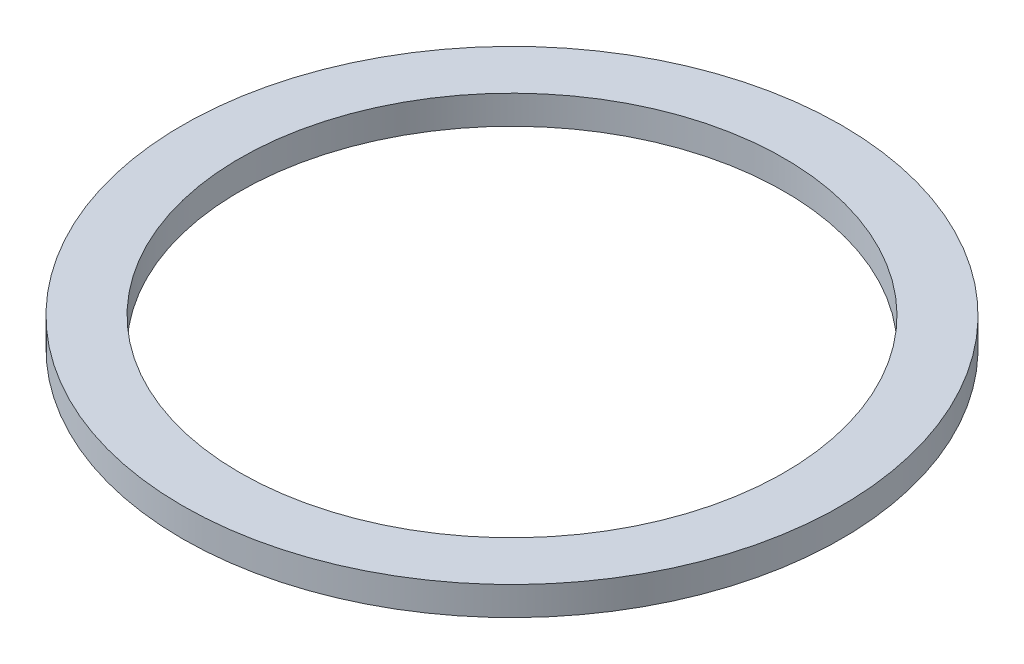
ISO-10303-21;
HEADER;
FILE_DESCRIPTION(('STEP AP214'),'2;1');
FILE_NAME('part.step','',(''),(''),'','','');
FILE_SCHEMA(('AUTOMOTIVE_DESIGN { 1 0 10303 214 1 1 1 1 }'));
ENDSEC;
DATA;
#1=APPLICATION_CONTEXT('core data for automotive mechanical design processes');
#2=APPLICATION_PROTOCOL_DEFINITION('international standard','automotive_design',2000,#1);
#3=PRODUCT_CONTEXT('',#1,'mechanical');
#4=PRODUCT('Part','Part','',(#3));
#5=PRODUCT_RELATED_PRODUCT_CATEGORY('part','',(#4));
#6=PRODUCT_DEFINITION_FORMATION('','',#4);
#7=PRODUCT_DEFINITION_CONTEXT('part definition',#1,'design');
#8=PRODUCT_DEFINITION('design','',#6,#7);
#9=PRODUCT_DEFINITION_SHAPE('','',#8);
#10=(LENGTH_UNIT() NAMED_UNIT(*) SI_UNIT(.MILLI.,.METRE.));
#11=(NAMED_UNIT(*) PLANE_ANGLE_UNIT() SI_UNIT($,.RADIAN.));
#12=(NAMED_UNIT(*) SI_UNIT($,.STERADIAN.) SOLID_ANGLE_UNIT());
#13=UNCERTAINTY_MEASURE_WITH_UNIT(LENGTH_MEASURE(1.E-05),#10,'distance_accuracy_value','');
#14=(GEOMETRIC_REPRESENTATION_CONTEXT(3) GLOBAL_UNCERTAINTY_ASSIGNED_CONTEXT((#13)) GLOBAL_UNIT_ASSIGNED_CONTEXT((#10,
#11,#12)) REPRESENTATION_CONTEXT('',''));
#15=CARTESIAN_POINT('',(0.,0.,0.));
#16=DIRECTION('',(0.,0.,1.));
#17=DIRECTION('',(1.,0.,0.));
#18=AXIS2_PLACEMENT_3D('',#15,#16,#17);
#19=CARTESIAN_POINT('',(0.,2.5,0.));
#20=DIRECTION('',(0.,1.,0.));
#21=DIRECTION('',(0.,0.,1.));
#22=AXIS2_PLACEMENT_3D('',#19,#20,#21);
#23=PLANE('',#22);
#24=CARTESIAN_POINT('',(0.,2.5,0.));
#25=DIRECTION('',(0.,1.,0.));
#26=DIRECTION('',(0.,0.,1.));
#27=AXIS2_PLACEMENT_3D('',#24,#25,#26);
#28=CIRCLE('',#27,57.5);
#29=CARTESIAN_POINT('',(0.,2.5,57.5));
#30=VERTEX_POINT('',#29);
#31=EDGE_CURVE('E10',#30,#30,#28,.T.);
#32=ORIENTED_EDGE('',*,*,#31,.T.);
#33=EDGE_LOOP('',(#32));
#34=FACE_BOUND('',#33,.T.);
#35=CARTESIAN_POINT('',(0.,2.5,0.));
#36=DIRECTION('',(0.,1.,0.));
#37=DIRECTION('',(0.,0.,1.));
#38=AXIS2_PLACEMENT_3D('',#35,#36,#37);
#39=CIRCLE('',#38,47.5);
#40=CARTESIAN_POINT('',(0.,2.5,47.5));
#41=VERTEX_POINT('',#40);
#42=EDGE_CURVE('E42',#41,#41,#39,.T.);
#43=ORIENTED_EDGE('',*,*,#42,.F.);
#44=EDGE_LOOP('',(#43));
#45=FACE_BOUND('',#44,.T.);
#46=ADVANCED_FACE('F31',(#34,#45),#23,.T.);
#47=CARTESIAN_POINT('',(0.,-2.5,0.));
#48=DIRECTION('',(0.,1.,0.));
#49=DIRECTION('',(0.,0.,1.));
#50=AXIS2_PLACEMENT_3D('',#47,#48,#49);
#51=PLANE('',#50);
#52=CARTESIAN_POINT('',(0.,-2.5,0.));
#53=DIRECTION('',(0.,1.,0.));
#54=DIRECTION('',(0.,0.,1.));
#55=AXIS2_PLACEMENT_3D('',#52,#53,#54);
#56=CIRCLE('',#55,57.5);
#57=CARTESIAN_POINT('',(0.,-2.5,57.5));
#58=VERTEX_POINT('',#57);
#59=EDGE_CURVE('E35',#58,#58,#56,.T.);
#60=ORIENTED_EDGE('',*,*,#59,.F.);
#61=EDGE_LOOP('',(#60));
#62=FACE_BOUND('',#61,.T.);
#63=CARTESIAN_POINT('',(0.,-2.5,0.));
#64=DIRECTION('',(0.,1.,0.));
#65=DIRECTION('',(0.,0.,1.));
#66=AXIS2_PLACEMENT_3D('',#63,#64,#65);
#67=CIRCLE('',#66,47.5);
#68=CARTESIAN_POINT('',(0.,-2.5,47.5));
#69=VERTEX_POINT('',#68);
#70=EDGE_CURVE('E44',#69,#69,#67,.T.);
#71=ORIENTED_EDGE('',*,*,#70,.T.);
#72=EDGE_LOOP('',(#71));
#73=FACE_BOUND('',#72,.T.);
#74=ADVANCED_FACE('F54',(#62,#73),#51,.F.);
#75=CARTESIAN_POINT('',(0.,2.5,0.));
#76=DIRECTION('',(0.,-1.,0.));
#77=DIRECTION('',(0.,0.,-1.));
#78=AXIS2_PLACEMENT_3D('',#75,#76,#77);
#79=CYLINDRICAL_SURFACE('',#78,57.5);
#80=ORIENTED_EDGE('',*,*,#31,.F.);
#81=EDGE_LOOP('',(#80));
#82=FACE_BOUND('',#81,.T.);
#83=ORIENTED_EDGE('',*,*,#59,.T.);
#84=EDGE_LOOP('',(#83));
#85=FACE_BOUND('',#84,.T.);
#86=ADVANCED_FACE('F33',(#82,#85),#79,.T.);
#87=CARTESIAN_POINT('',(0.,2.5,0.));
#88=DIRECTION('',(0.,-1.,0.));
#89=DIRECTION('',(0.,0.,-1.));
#90=AXIS2_PLACEMENT_3D('',#87,#88,#89);
#91=CYLINDRICAL_SURFACE('',#90,47.5);
#92=ORIENTED_EDGE('',*,*,#42,.T.);
#93=EDGE_LOOP('',(#92));
#94=FACE_BOUND('',#93,.T.);
#95=ORIENTED_EDGE('',*,*,#70,.F.);
#96=EDGE_LOOP('',(#95));
#97=FACE_BOUND('',#96,.T.);
#98=ADVANCED_FACE('F50',(#94,#97),#91,.F.);
#99=CLOSED_SHELL('',(#46,#74,#86,#98));
#100=MANIFOLD_SOLID_BREP('B2',#99);
#101=ADVANCED_BREP_SHAPE_REPRESENTATION('',(#18,#100),#14);
#102=SHAPE_DEFINITION_REPRESENTATION(#9,#101);
ENDSEC;
END-ISO-10303-21;
